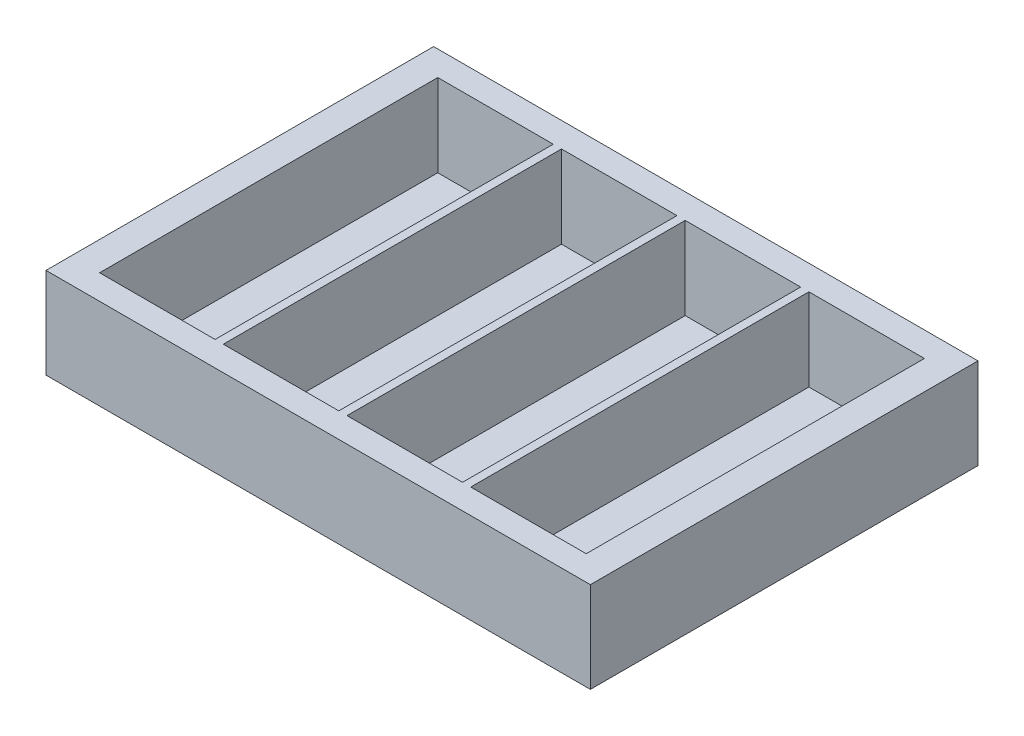
ISO-10303-21;
HEADER;
FILE_DESCRIPTION(('STEP AP214'),'2;1');
FILE_NAME('part.step','',(''),(''),'','','');
FILE_SCHEMA(('AUTOMOTIVE_DESIGN { 1 0 10303 214 1 1 1 1 }'));
ENDSEC;
DATA;
#1=APPLICATION_CONTEXT('core data for automotive mechanical design processes');
#2=APPLICATION_PROTOCOL_DEFINITION('international standard','automotive_design',2000,#1);
#3=PRODUCT_CONTEXT('',#1,'mechanical');
#4=PRODUCT('Part','Part','',(#3));
#5=PRODUCT_RELATED_PRODUCT_CATEGORY('part','',(#4));
#6=PRODUCT_DEFINITION_FORMATION('','',#4);
#7=PRODUCT_DEFINITION_CONTEXT('part definition',#1,'design');
#8=PRODUCT_DEFINITION('design','',#6,#7);
#9=PRODUCT_DEFINITION_SHAPE('','',#8);
#10=(LENGTH_UNIT() NAMED_UNIT(*) SI_UNIT(.MILLI.,.METRE.));
#11=(NAMED_UNIT(*) PLANE_ANGLE_UNIT() SI_UNIT($,.RADIAN.));
#12=(NAMED_UNIT(*) SI_UNIT($,.STERADIAN.) SOLID_ANGLE_UNIT());
#13=UNCERTAINTY_MEASURE_WITH_UNIT(LENGTH_MEASURE(1.E-05),#10,'distance_accuracy_value','');
#14=(GEOMETRIC_REPRESENTATION_CONTEXT(3) GLOBAL_UNCERTAINTY_ASSIGNED_CONTEXT((#13)) GLOBAL_UNIT_ASSIGNED_CONTEXT((#10,
#11,#12)) REPRESENTATION_CONTEXT('',''));
#15=CARTESIAN_POINT('',(0.,0.,0.));
#16=DIRECTION('',(0.,0.,1.));
#17=DIRECTION('',(1.,0.,0.));
#18=AXIS2_PLACEMENT_3D('',#15,#16,#17);
#19=CARTESIAN_POINT('',(-29.5,10.,-20.5));
#20=DIRECTION('',(0.,0.,1.));
#21=DIRECTION('',(1.,0.,0.));
#22=AXIS2_PLACEMENT_3D('',#19,#20,#21);
#23=PLANE('',#22);
#24=DIRECTION('',(-1.,0.,0.));
#25=VECTOR('',#24,1.);
#26=CARTESIAN_POINT('',(-29.5,10.,-20.5));
#27=LINE('',#26,#25);
#28=CARTESIAN_POINT('',(29.5,10.,-20.5));
#29=VERTEX_POINT('',#28);
#30=CARTESIAN_POINT('',(15.5,10.,-20.5));
#31=VERTEX_POINT('',#30);
#32=EDGE_CURVE('E188',#29,#31,#27,.T.);
#33=ORIENTED_EDGE('',*,*,#32,.T.);
#34=DIRECTION('',(0.,1.,0.));
#35=VECTOR('',#34,1.);
#36=CARTESIAN_POINT('',(15.5,0.,-20.5));
#37=LINE('',#36,#35);
#38=CARTESIAN_POINT('',(15.5,0.,-20.5));
#39=VERTEX_POINT('',#38);
#40=EDGE_CURVE('E63',#39,#31,#37,.T.);
#41=ORIENTED_EDGE('',*,*,#40,.F.);
#42=DIRECTION('',(-1.,0.,0.));
#43=VECTOR('',#42,1.);
#44=CARTESIAN_POINT('',(-29.5,0.,-20.5));
#45=LINE('',#44,#43);
#46=CARTESIAN_POINT('',(29.5,0.,-20.5));
#47=VERTEX_POINT('',#46);
#48=EDGE_CURVE('E281',#47,#39,#45,.T.);
#49=ORIENTED_EDGE('',*,*,#48,.F.);
#50=DIRECTION('',(0.,-1.,0.));
#51=VECTOR('',#50,1.);
#52=CARTESIAN_POINT('',(29.5,10.,-20.5));
#53=LINE('',#52,#51);
#54=EDGE_CURVE('E297',#29,#47,#53,.T.);
#55=ORIENTED_EDGE('',*,*,#54,.F.);
#56=EDGE_LOOP('',(#33,#41,#49,#55));
#57=FACE_BOUND('',#56,.T.);
#58=ADVANCED_FACE('F40',(#57),#23,.T.);
#59=CARTESIAN_POINT('',(-29.5,10.,20.5));
#60=DIRECTION('',(0.,0.,-1.));
#61=DIRECTION('',(-1.,0.,0.));
#62=AXIS2_PLACEMENT_3D('',#59,#60,#61);
#63=PLANE('',#62);
#64=DIRECTION('',(1.,0.,0.));
#65=VECTOR('',#64,1.);
#66=CARTESIAN_POINT('',(-29.5,0.,20.5));
#67=LINE('',#66,#65);
#68=CARTESIAN_POINT('',(15.5,0.,20.5));
#69=VERTEX_POINT('',#68);
#70=CARTESIAN_POINT('',(29.5,0.,20.5));
#71=VERTEX_POINT('',#70);
#72=EDGE_CURVE('E286',#69,#71,#67,.T.);
#73=ORIENTED_EDGE('',*,*,#72,.F.);
#74=DIRECTION('',(0.,1.,0.));
#75=VECTOR('',#74,1.);
#76=CARTESIAN_POINT('',(15.5,0.,20.5));
#77=LINE('',#76,#75);
#78=CARTESIAN_POINT('',(15.5,10.,20.5));
#79=VERTEX_POINT('',#78);
#80=EDGE_CURVE('E208',#69,#79,#77,.T.);
#81=ORIENTED_EDGE('',*,*,#80,.T.);
#82=DIRECTION('',(1.,0.,0.));
#83=VECTOR('',#82,1.);
#84=CARTESIAN_POINT('',(-29.5,10.,20.5));
#85=LINE('',#84,#83);
#86=CARTESIAN_POINT('',(29.5,10.,20.5));
#87=VERTEX_POINT('',#86);
#88=EDGE_CURVE('E272',#79,#87,#85,.T.);
#89=ORIENTED_EDGE('',*,*,#88,.T.);
#90=DIRECTION('',(0.,-1.,0.));
#91=VECTOR('',#90,1.);
#92=CARTESIAN_POINT('',(29.5,10.,20.5));
#93=LINE('',#92,#91);
#94=EDGE_CURVE('E276',#87,#71,#93,.T.);
#95=ORIENTED_EDGE('',*,*,#94,.T.);
#96=EDGE_LOOP('',(#73,#81,#89,#95));
#97=FACE_BOUND('',#96,.T.);
#98=ADVANCED_FACE('F362',(#97),#63,.T.);
#99=CARTESIAN_POINT('',(0.,0.,0.));
#100=DIRECTION('',(0.,-1.,0.));
#101=DIRECTION('',(0.,0.,-1.));
#102=AXIS2_PLACEMENT_3D('',#99,#100,#101);
#103=PLANE('',#102);
#104=DIRECTION('',(0.,0.,1.));
#105=VECTOR('',#104,1.);
#106=CARTESIAN_POINT('',(15.5,0.,0.));
#107=LINE('',#106,#105);
#108=EDGE_CURVE('E200',#39,#69,#107,.T.);
#109=ORIENTED_EDGE('',*,*,#108,.T.);
#110=ORIENTED_EDGE('',*,*,#72,.T.);
#111=DIRECTION('',(0.,0.,-1.));
#112=VECTOR('',#111,1.);
#113=CARTESIAN_POINT('',(29.5,0.,-20.5));
#114=LINE('',#113,#112);
#115=EDGE_CURVE('E264',#71,#47,#114,.T.);
#116=ORIENTED_EDGE('',*,*,#115,.T.);
#117=ORIENTED_EDGE('',*,*,#48,.T.);
#118=EDGE_LOOP('',(#109,#110,#116,#117));
#119=FACE_BOUND('',#118,.T.);
#120=ADVANCED_FACE('F375',(#119),#103,.F.);
#121=DIRECTION('',(0.,1.,0.));
#122=VECTOR('',#121,1.);
#123=CARTESIAN_POINT('',(14.5,0.,-20.5));
#124=LINE('',#123,#122);
#125=CARTESIAN_POINT('',(14.5,0.,-20.5));
#126=VERTEX_POINT('',#125);
#127=CARTESIAN_POINT('',(14.5,10.,-20.5));
#128=VERTEX_POINT('',#127);
#129=EDGE_CURVE('E192',#126,#128,#124,.T.);
#130=ORIENTED_EDGE('',*,*,#129,.T.);
#131=CARTESIAN_POINT('',(0.499999999999994,10.,-20.5));
#132=VERTEX_POINT('',#131);
#133=EDGE_CURVE('E177',#128,#132,#27,.T.);
#134=ORIENTED_EDGE('',*,*,#133,.T.);
#135=DIRECTION('',(0.,1.,0.));
#136=VECTOR('',#135,1.);
#137=CARTESIAN_POINT('',(0.499999999999998,0.,-20.5));
#138=LINE('',#137,#136);
#139=CARTESIAN_POINT('',(0.499999999999994,0.,-20.5));
#140=VERTEX_POINT('',#139);
#141=EDGE_CURVE('E222',#140,#132,#138,.T.);
#142=ORIENTED_EDGE('',*,*,#141,.F.);
#143=EDGE_CURVE('E194',#126,#140,#45,.T.);
#144=ORIENTED_EDGE('',*,*,#143,.F.);
#145=EDGE_LOOP('',(#130,#134,#142,#144));
#146=FACE_BOUND('',#145,.T.);
#147=ADVANCED_FACE('F193',(#146),#23,.T.);
#148=DIRECTION('',(0.,1.,0.));
#149=VECTOR('',#148,1.);
#150=CARTESIAN_POINT('',(14.5,0.,20.5));
#151=LINE('',#150,#149);
#152=CARTESIAN_POINT('',(14.5,0.,20.5));
#153=VERTEX_POINT('',#152);
#154=CARTESIAN_POINT('',(14.5,10.,20.5));
#155=VERTEX_POINT('',#154);
#156=EDGE_CURVE('E196',#153,#155,#151,.T.);
#157=ORIENTED_EDGE('',*,*,#156,.F.);
#158=CARTESIAN_POINT('',(0.499999999999997,0.,20.5));
#159=VERTEX_POINT('',#158);
#160=EDGE_CURVE('E376',#159,#153,#67,.T.);
#161=ORIENTED_EDGE('',*,*,#160,.F.);
#162=DIRECTION('',(0.,1.,0.));
#163=VECTOR('',#162,1.);
#164=CARTESIAN_POINT('',(0.500000000000003,0.,20.5));
#165=LINE('',#164,#163);
#166=CARTESIAN_POINT('',(0.500000000000003,10.,20.5));
#167=VERTEX_POINT('',#166);
#168=EDGE_CURVE('E225',#159,#167,#165,.T.);
#169=ORIENTED_EDGE('',*,*,#168,.T.);
#170=EDGE_CURVE('E356',#167,#155,#85,.T.);
#171=ORIENTED_EDGE('',*,*,#170,.T.);
#172=EDGE_LOOP('',(#157,#161,#169,#171));
#173=FACE_BOUND('',#172,.T.);
#174=ADVANCED_FACE('F387',(#173),#63,.T.);
#175=ORIENTED_EDGE('',*,*,#160,.T.);
#176=DIRECTION('',(0.,0.,1.));
#177=VECTOR('',#176,1.);
#178=CARTESIAN_POINT('',(14.5,0.,0.));
#179=LINE('',#178,#177);
#180=EDGE_CURVE('E55',#126,#153,#179,.T.);
#181=ORIENTED_EDGE('',*,*,#180,.F.);
#182=ORIENTED_EDGE('',*,*,#143,.T.);
#183=DIRECTION('',(0.,0.,1.));
#184=VECTOR('',#183,1.);
#185=CARTESIAN_POINT('',(0.5,0.,0.));
#186=LINE('',#185,#184);
#187=EDGE_CURVE('E216',#140,#159,#186,.T.);
#188=ORIENTED_EDGE('',*,*,#187,.T.);
#189=EDGE_LOOP('',(#175,#181,#182,#188));
#190=FACE_BOUND('',#189,.T.);
#191=ADVANCED_FACE('F394',(#190),#103,.F.);
#192=DIRECTION('',(0.,1.,0.));
#193=VECTOR('',#192,1.);
#194=CARTESIAN_POINT('',(-0.500000000000002,0.,-20.5));
#195=LINE('',#194,#193);
#196=CARTESIAN_POINT('',(-0.500000000000007,0.,-20.5));
#197=VERTEX_POINT('',#196);
#198=CARTESIAN_POINT('',(-0.500000000000007,10.,-20.5));
#199=VERTEX_POINT('',#198);
#200=EDGE_CURVE('E218',#197,#199,#195,.T.);
#201=ORIENTED_EDGE('',*,*,#200,.T.);
#202=CARTESIAN_POINT('',(-14.5,10.,-20.5));
#203=VERTEX_POINT('',#202);
#204=EDGE_CURVE('E189',#199,#203,#27,.T.);
#205=ORIENTED_EDGE('',*,*,#204,.T.);
#206=DIRECTION('',(0.,1.,0.));
#207=VECTOR('',#206,1.);
#208=CARTESIAN_POINT('',(-14.5,0.,-20.5));
#209=LINE('',#208,#207);
#210=CARTESIAN_POINT('',(-14.5,0.,-20.5));
#211=VERTEX_POINT('',#210);
#212=EDGE_CURVE('E238',#211,#203,#209,.T.);
#213=ORIENTED_EDGE('',*,*,#212,.F.);
#214=EDGE_CURVE('E422',#197,#211,#45,.T.);
#215=ORIENTED_EDGE('',*,*,#214,.F.);
#216=EDGE_LOOP('',(#201,#205,#213,#215));
#217=FACE_BOUND('',#216,.T.);
#218=ADVANCED_FACE('F345',(#217),#23,.T.);
#219=DIRECTION('',(0.,1.,0.));
#220=VECTOR('',#219,1.);
#221=CARTESIAN_POINT('',(-0.5,0.,20.5));
#222=LINE('',#221,#220);
#223=CARTESIAN_POINT('',(-0.500000000000007,0.,20.5));
#224=VERTEX_POINT('',#223);
#225=CARTESIAN_POINT('',(-0.500000000000007,10.,20.5));
#226=VERTEX_POINT('',#225);
#227=EDGE_CURVE('E228',#224,#226,#222,.T.);
#228=ORIENTED_EDGE('',*,*,#227,.F.);
#229=CARTESIAN_POINT('',(-14.5,0.,20.5));
#230=VERTEX_POINT('',#229);
#231=EDGE_CURVE('E289',#230,#224,#67,.T.);
#232=ORIENTED_EDGE('',*,*,#231,.F.);
#233=DIRECTION('',(0.,1.,0.));
#234=VECTOR('',#233,1.);
#235=CARTESIAN_POINT('',(-14.5,0.,20.5));
#236=LINE('',#235,#234);
#237=CARTESIAN_POINT('',(-14.5,10.,20.5));
#238=VERTEX_POINT('',#237);
#239=EDGE_CURVE('E242',#230,#238,#236,.T.);
#240=ORIENTED_EDGE('',*,*,#239,.T.);
#241=EDGE_CURVE('E277',#238,#226,#85,.T.);
#242=ORIENTED_EDGE('',*,*,#241,.T.);
#243=EDGE_LOOP('',(#228,#232,#240,#242));
#244=FACE_BOUND('',#243,.T.);
#245=ADVANCED_FACE('F383',(#244),#63,.T.);
#246=ORIENTED_EDGE('',*,*,#231,.T.);
#247=DIRECTION('',(0.,0.,1.));
#248=VECTOR('',#247,1.);
#249=CARTESIAN_POINT('',(-0.5,0.,0.));
#250=LINE('',#249,#248);
#251=EDGE_CURVE('E213',#197,#224,#250,.T.);
#252=ORIENTED_EDGE('',*,*,#251,.F.);
#253=ORIENTED_EDGE('',*,*,#214,.T.);
#254=DIRECTION('',(0.,0.,1.));
#255=VECTOR('',#254,1.);
#256=CARTESIAN_POINT('',(-14.5,0.,0.));
#257=LINE('',#256,#255);
#258=EDGE_CURVE('E232',#211,#230,#257,.T.);
#259=ORIENTED_EDGE('',*,*,#258,.T.);
#260=EDGE_LOOP('',(#246,#252,#253,#259));
#261=FACE_BOUND('',#260,.T.);
#262=ADVANCED_FACE('F335',(#261),#103,.F.);
#263=CARTESIAN_POINT('',(0.,10.,0.));
#264=DIRECTION('',(0.,1.,0.));
#265=DIRECTION('',(0.,0.,1.));
#266=AXIS2_PLACEMENT_3D('',#263,#264,#265);
#267=PLANE('',#266);
#268=DIRECTION('',(0.,0.,1.));
#269=VECTOR('',#268,1.);
#270=CARTESIAN_POINT('',(14.5,10.,0.));
#271=LINE('',#270,#269);
#272=EDGE_CURVE('E182',#128,#155,#271,.T.);
#273=ORIENTED_EDGE('',*,*,#272,.T.);
#274=ORIENTED_EDGE('',*,*,#170,.F.);
#275=DIRECTION('',(0.,0.,1.));
#276=VECTOR('',#275,1.);
#277=CARTESIAN_POINT('',(0.5,10.,0.));
#278=LINE('',#277,#276);
#279=EDGE_CURVE('E184',#132,#167,#278,.T.);
#280=ORIENTED_EDGE('',*,*,#279,.F.);
#281=ORIENTED_EDGE('',*,*,#133,.F.);
#282=EDGE_LOOP('',(#273,#274,#280,#281));
#283=FACE_BOUND('',#282,.T.);
#284=ORIENTED_EDGE('',*,*,#88,.F.);
#285=DIRECTION('',(0.,0.,1.));
#286=VECTOR('',#285,1.);
#287=CARTESIAN_POINT('',(15.5,10.,0.));
#288=LINE('',#287,#286);
#289=EDGE_CURVE('E201',#31,#79,#288,.T.);
#290=ORIENTED_EDGE('',*,*,#289,.F.);
#291=ORIENTED_EDGE('',*,*,#32,.F.);
#292=DIRECTION('',(0.,0.,-1.));
#293=VECTOR('',#292,1.);
#294=CARTESIAN_POINT('',(29.5,10.,-20.5));
#295=LINE('',#294,#293);
#296=EDGE_CURVE('E265',#87,#29,#295,.T.);
#297=ORIENTED_EDGE('',*,*,#296,.F.);
#298=EDGE_LOOP('',(#284,#290,#291,#297));
#299=FACE_BOUND('',#298,.T.);
#300=DIRECTION('',(0.,0.,1.));
#301=VECTOR('',#300,1.);
#302=CARTESIAN_POINT('',(-14.5,10.,0.));
#303=LINE('',#302,#301);
#304=EDGE_CURVE('E224',#203,#238,#303,.T.);
#305=ORIENTED_EDGE('',*,*,#304,.F.);
#306=ORIENTED_EDGE('',*,*,#204,.F.);
#307=DIRECTION('',(0.,0.,1.));
#308=VECTOR('',#307,1.);
#309=CARTESIAN_POINT('',(-0.5,10.,0.));
#310=LINE('',#309,#308);
#311=EDGE_CURVE('E210',#199,#226,#310,.T.);
#312=ORIENTED_EDGE('',*,*,#311,.T.);
#313=ORIENTED_EDGE('',*,*,#241,.F.);
#314=EDGE_LOOP('',(#305,#306,#312,#313));
#315=FACE_BOUND('',#314,.T.);
#316=DIRECTION('',(0.,0.,-1.));
#317=VECTOR('',#316,1.);
#318=CARTESIAN_POINT('',(33.,10.,-23.5));
#319=LINE('',#318,#317);
#320=CARTESIAN_POINT('',(33.,10.,23.5));
#321=VERTEX_POINT('',#320);
#322=CARTESIAN_POINT('',(33.,10.,-23.5));
#323=VERTEX_POINT('',#322);
#324=EDGE_CURVE('E300',#321,#323,#319,.T.);
#325=ORIENTED_EDGE('',*,*,#324,.T.);
#326=DIRECTION('',(-1.,0.,0.));
#327=VECTOR('',#326,1.);
#328=CARTESIAN_POINT('',(-33.,10.,-23.5));
#329=LINE('',#328,#327);
#330=CARTESIAN_POINT('',(-33.,10.,-23.5));
#331=VERTEX_POINT('',#330);
#332=EDGE_CURVE('E303',#323,#331,#329,.T.);
#333=ORIENTED_EDGE('',*,*,#332,.T.);
#334=DIRECTION('',(0.,0.,1.));
#335=VECTOR('',#334,1.);
#336=CARTESIAN_POINT('',(-33.,10.,-23.5));
#337=LINE('',#336,#335);
#338=CARTESIAN_POINT('',(-33.,10.,23.5));
#339=VERTEX_POINT('',#338);
#340=EDGE_CURVE('E305',#331,#339,#337,.T.);
#341=ORIENTED_EDGE('',*,*,#340,.T.);
#342=DIRECTION('',(1.,0.,0.));
#343=VECTOR('',#342,1.);
#344=CARTESIAN_POINT('',(-33.,10.,23.5));
#345=LINE('',#344,#343);
#346=EDGE_CURVE('E307',#339,#321,#345,.T.);
#347=ORIENTED_EDGE('',*,*,#346,.T.);
#348=EDGE_LOOP('',(#325,#333,#341,#347));
#349=FACE_BOUND('',#348,.T.);
#350=CARTESIAN_POINT('',(-15.5,10.,-20.5));
#351=VERTEX_POINT('',#350);
#352=CARTESIAN_POINT('',(-29.5,10.,-20.5));
#353=VERTEX_POINT('',#352);
#354=EDGE_CURVE('E266',#351,#353,#27,.T.);
#355=ORIENTED_EDGE('',*,*,#354,.F.);
#356=DIRECTION('',(0.,0.,1.));
#357=VECTOR('',#356,1.);
#358=CARTESIAN_POINT('',(-15.5,10.,0.));
#359=LINE('',#358,#357);
#360=CARTESIAN_POINT('',(-15.5,10.,20.5));
#361=VERTEX_POINT('',#360);
#362=EDGE_CURVE('E236',#351,#361,#359,.T.);
#363=ORIENTED_EDGE('',*,*,#362,.T.);
#364=CARTESIAN_POINT('',(-29.5,10.,20.5));
#365=VERTEX_POINT('',#364);
#366=EDGE_CURVE('E273',#365,#361,#85,.T.);
#367=ORIENTED_EDGE('',*,*,#366,.F.);
#368=DIRECTION('',(0.,0.,1.));
#369=VECTOR('',#368,1.);
#370=CARTESIAN_POINT('',(-29.5,10.,-20.5));
#371=LINE('',#370,#369);
#372=EDGE_CURVE('E269',#353,#365,#371,.T.);
#373=ORIENTED_EDGE('',*,*,#372,.F.);
#374=EDGE_LOOP('',(#355,#363,#367,#373));
#375=FACE_BOUND('',#374,.T.);
#376=ADVANCED_FACE('F179',(#283,#299,#315,#349,#375),#267,.T.);
#377=CARTESIAN_POINT('',(33.,10.,-23.5));
#378=DIRECTION('',(-1.,0.,0.));
#379=DIRECTION('',(0.,0.,1.));
#380=AXIS2_PLACEMENT_3D('',#377,#378,#379);
#381=PLANE('',#380);
#382=DIRECTION('',(0.,-1.,0.));
#383=VECTOR('',#382,1.);
#384=CARTESIAN_POINT('',(33.,10.,23.5));
#385=LINE('',#384,#383);
#386=CARTESIAN_POINT('',(33.,-1.,23.5));
#387=VERTEX_POINT('',#386);
#388=EDGE_CURVE('E309',#321,#387,#385,.T.);
#389=ORIENTED_EDGE('',*,*,#388,.T.);
#390=DIRECTION('',(0.,0.,1.));
#391=VECTOR('',#390,1.);
#392=CARTESIAN_POINT('',(33.,-1.,23.5));
#393=LINE('',#392,#391);
#394=CARTESIAN_POINT('',(33.,-1.,-23.5));
#395=VERTEX_POINT('',#394);
#396=EDGE_CURVE('E245',#395,#387,#393,.T.);
#397=ORIENTED_EDGE('',*,*,#396,.F.);
#398=DIRECTION('',(0.,-1.,0.));
#399=VECTOR('',#398,1.);
#400=CARTESIAN_POINT('',(33.,10.,-23.5));
#401=LINE('',#400,#399);
#402=EDGE_CURVE('E11',#323,#395,#401,.T.);
#403=ORIENTED_EDGE('',*,*,#402,.F.);
#404=ORIENTED_EDGE('',*,*,#324,.F.);
#405=EDGE_LOOP('',(#389,#397,#403,#404));
#406=FACE_BOUND('',#405,.T.);
#407=ADVANCED_FACE('F42',(#406),#381,.F.);
#408=CARTESIAN_POINT('',(-33.,10.,-23.5));
#409=DIRECTION('',(0.,0.,1.));
#410=DIRECTION('',(1.,0.,0.));
#411=AXIS2_PLACEMENT_3D('',#408,#409,#410);
#412=PLANE('',#411);
#413=ORIENTED_EDGE('',*,*,#402,.T.);
#414=DIRECTION('',(1.,0.,0.));
#415=VECTOR('',#414,1.);
#416=CARTESIAN_POINT('',(-33.,-1.,-23.5));
#417=LINE('',#416,#415);
#418=CARTESIAN_POINT('',(-33.,-1.,-23.5));
#419=VERTEX_POINT('',#418);
#420=EDGE_CURVE('E261',#419,#395,#417,.T.);
#421=ORIENTED_EDGE('',*,*,#420,.F.);
#422=DIRECTION('',(0.,-1.,0.));
#423=VECTOR('',#422,1.);
#424=CARTESIAN_POINT('',(-33.,10.,-23.5));
#425=LINE('',#424,#423);
#426=EDGE_CURVE('E48',#331,#419,#425,.T.);
#427=ORIENTED_EDGE('',*,*,#426,.F.);
#428=ORIENTED_EDGE('',*,*,#332,.F.);
#429=EDGE_LOOP('',(#413,#421,#427,#428));
#430=FACE_BOUND('',#429,.T.);
#431=ADVANCED_FACE('F324',(#430),#412,.F.);
#432=CARTESIAN_POINT('',(-33.,10.,-23.5));
#433=DIRECTION('',(1.,0.,0.));
#434=DIRECTION('',(0.,0.,-1.));
#435=AXIS2_PLACEMENT_3D('',#432,#433,#434);
#436=PLANE('',#435);
#437=ORIENTED_EDGE('',*,*,#426,.T.);
#438=DIRECTION('',(0.,0.,-1.));
#439=VECTOR('',#438,1.);
#440=CARTESIAN_POINT('',(-33.,-1.,23.5));
#441=LINE('',#440,#439);
#442=CARTESIAN_POINT('',(-33.,-1.,23.5));
#443=VERTEX_POINT('',#442);
#444=EDGE_CURVE('E258',#443,#419,#441,.T.);
#445=ORIENTED_EDGE('',*,*,#444,.F.);
#446=DIRECTION('',(0.,-1.,0.));
#447=VECTOR('',#446,1.);
#448=CARTESIAN_POINT('',(-33.,10.,23.5));
#449=LINE('',#448,#447);
#450=EDGE_CURVE('E311',#339,#443,#449,.T.);
#451=ORIENTED_EDGE('',*,*,#450,.F.);
#452=ORIENTED_EDGE('',*,*,#340,.F.);
#453=EDGE_LOOP('',(#437,#445,#451,#452));
#454=FACE_BOUND('',#453,.T.);
#455=ADVANCED_FACE('F316',(#454),#436,.F.);
#456=CARTESIAN_POINT('',(-33.,10.,23.5));
#457=DIRECTION('',(0.,0.,-1.));
#458=DIRECTION('',(-1.,0.,0.));
#459=AXIS2_PLACEMENT_3D('',#456,#457,#458);
#460=PLANE('',#459);
#461=ORIENTED_EDGE('',*,*,#450,.T.);
#462=DIRECTION('',(-1.,0.,0.));
#463=VECTOR('',#462,1.);
#464=CARTESIAN_POINT('',(-33.,-1.,23.5));
#465=LINE('',#464,#463);
#466=EDGE_CURVE('E255',#387,#443,#465,.T.);
#467=ORIENTED_EDGE('',*,*,#466,.F.);
#468=ORIENTED_EDGE('',*,*,#388,.F.);
#469=ORIENTED_EDGE('',*,*,#346,.F.);
#470=EDGE_LOOP('',(#461,#467,#468,#469));
#471=FACE_BOUND('',#470,.T.);
#472=ADVANCED_FACE('F331',(#471),#460,.F.);
#473=CARTESIAN_POINT('',(29.5,10.,-20.5));
#474=DIRECTION('',(-1.,0.,0.));
#475=DIRECTION('',(0.,0.,1.));
#476=AXIS2_PLACEMENT_3D('',#473,#474,#475);
#477=PLANE('',#476);
#478=ORIENTED_EDGE('',*,*,#115,.F.);
#479=ORIENTED_EDGE('',*,*,#94,.F.);
#480=ORIENTED_EDGE('',*,*,#296,.T.);
#481=ORIENTED_EDGE('',*,*,#54,.T.);
#482=EDGE_LOOP('',(#478,#479,#480,#481));
#483=FACE_BOUND('',#482,.T.);
#484=ADVANCED_FACE('F368',(#483),#477,.T.);
#485=DIRECTION('',(0.,1.,0.));
#486=VECTOR('',#485,1.);
#487=CARTESIAN_POINT('',(-15.5,0.,-20.5));
#488=LINE('',#487,#486);
#489=CARTESIAN_POINT('',(-15.5,0.,-20.5));
#490=VERTEX_POINT('',#489);
#491=EDGE_CURVE('E248',#490,#351,#488,.T.);
#492=ORIENTED_EDGE('',*,*,#491,.T.);
#493=ORIENTED_EDGE('',*,*,#354,.T.);
#494=DIRECTION('',(0.,-1.,0.));
#495=VECTOR('',#494,1.);
#496=CARTESIAN_POINT('',(-29.5,10.,-20.5));
#497=LINE('',#496,#495);
#498=CARTESIAN_POINT('',(-29.5,0.,-20.5));
#499=VERTEX_POINT('',#498);
#500=EDGE_CURVE('E294',#353,#499,#497,.T.);
#501=ORIENTED_EDGE('',*,*,#500,.T.);
#502=EDGE_CURVE('E280',#490,#499,#45,.T.);
#503=ORIENTED_EDGE('',*,*,#502,.F.);
#504=EDGE_LOOP('',(#492,#493,#501,#503));
#505=FACE_BOUND('',#504,.T.);
#506=ADVANCED_FACE('F396',(#505),#23,.T.);
#507=CARTESIAN_POINT('',(-29.5,10.,-20.5));
#508=DIRECTION('',(1.,0.,0.));
#509=DIRECTION('',(0.,0.,-1.));
#510=AXIS2_PLACEMENT_3D('',#507,#508,#509);
#511=PLANE('',#510);
#512=DIRECTION('',(0.,0.,1.));
#513=VECTOR('',#512,1.);
#514=CARTESIAN_POINT('',(-29.5,0.,-20.5));
#515=LINE('',#514,#513);
#516=CARTESIAN_POINT('',(-29.5,0.,20.5));
#517=VERTEX_POINT('',#516);
#518=EDGE_CURVE('E283',#499,#517,#515,.T.);
#519=ORIENTED_EDGE('',*,*,#518,.F.);
#520=ORIENTED_EDGE('',*,*,#500,.F.);
#521=ORIENTED_EDGE('',*,*,#372,.T.);
#522=DIRECTION('',(0.,-1.,0.));
#523=VECTOR('',#522,1.);
#524=CARTESIAN_POINT('',(-29.5,10.,20.5));
#525=LINE('',#524,#523);
#526=EDGE_CURVE('E292',#365,#517,#525,.T.);
#527=ORIENTED_EDGE('',*,*,#526,.T.);
#528=EDGE_LOOP('',(#519,#520,#521,#527));
#529=FACE_BOUND('',#528,.T.);
#530=ADVANCED_FACE('F399',(#529),#511,.T.);
#531=DIRECTION('',(0.,1.,0.));
#532=VECTOR('',#531,1.);
#533=CARTESIAN_POINT('',(-15.5,0.,20.5));
#534=LINE('',#533,#532);
#535=CARTESIAN_POINT('',(-15.5,0.,20.5));
#536=VERTEX_POINT('',#535);
#537=EDGE_CURVE('E246',#536,#361,#534,.T.);
#538=ORIENTED_EDGE('',*,*,#537,.F.);
#539=EDGE_CURVE('E267',#517,#536,#67,.T.);
#540=ORIENTED_EDGE('',*,*,#539,.F.);
#541=ORIENTED_EDGE('',*,*,#526,.F.);
#542=ORIENTED_EDGE('',*,*,#366,.T.);
#543=EDGE_LOOP('',(#538,#540,#541,#542));
#544=FACE_BOUND('',#543,.T.);
#545=ADVANCED_FACE('F386',(#544),#63,.T.);
#546=ORIENTED_EDGE('',*,*,#539,.T.);
#547=DIRECTION('',(0.,0.,1.));
#548=VECTOR('',#547,1.);
#549=CARTESIAN_POINT('',(-15.5,0.,0.));
#550=LINE('',#549,#548);
#551=EDGE_CURVE('E235',#490,#536,#550,.T.);
#552=ORIENTED_EDGE('',*,*,#551,.F.);
#553=ORIENTED_EDGE('',*,*,#502,.T.);
#554=ORIENTED_EDGE('',*,*,#518,.T.);
#555=EDGE_LOOP('',(#546,#552,#553,#554));
#556=FACE_BOUND('',#555,.T.);
#557=ADVANCED_FACE('F393',(#556),#103,.F.);
#558=CARTESIAN_POINT('',(0.,-1.,0.));
#559=DIRECTION('',(0.,-1.,0.));
#560=DIRECTION('',(0.,0.,-1.));
#561=AXIS2_PLACEMENT_3D('',#558,#559,#560);
#562=PLANE('',#561);
#563=ORIENTED_EDGE('',*,*,#396,.T.);
#564=ORIENTED_EDGE('',*,*,#466,.T.);
#565=ORIENTED_EDGE('',*,*,#444,.T.);
#566=ORIENTED_EDGE('',*,*,#420,.T.);
#567=EDGE_LOOP('',(#563,#564,#565,#566));
#568=FACE_BOUND('',#567,.T.);
#569=ADVANCED_FACE('F321',(#568),#562,.T.);
#570=CARTESIAN_POINT('',(-14.5,0.,0.));
#571=DIRECTION('',(-1.,0.,0.));
#572=DIRECTION('',(0.,0.,1.));
#573=AXIS2_PLACEMENT_3D('',#570,#571,#572);
#574=PLANE('',#573);
#575=ORIENTED_EDGE('',*,*,#304,.T.);
#576=ORIENTED_EDGE('',*,*,#239,.F.);
#577=ORIENTED_EDGE('',*,*,#258,.F.);
#578=ORIENTED_EDGE('',*,*,#212,.T.);
#579=EDGE_LOOP('',(#575,#576,#577,#578));
#580=FACE_BOUND('',#579,.T.);
#581=ADVANCED_FACE('F353',(#580),#574,.F.);
#582=CARTESIAN_POINT('',(-15.5,0.,0.));
#583=DIRECTION('',(-1.,0.,0.));
#584=DIRECTION('',(0.,0.,1.));
#585=AXIS2_PLACEMENT_3D('',#582,#583,#584);
#586=PLANE('',#585);
#587=ORIENTED_EDGE('',*,*,#362,.F.);
#588=ORIENTED_EDGE('',*,*,#491,.F.);
#589=ORIENTED_EDGE('',*,*,#551,.T.);
#590=ORIENTED_EDGE('',*,*,#537,.T.);
#591=EDGE_LOOP('',(#587,#588,#589,#590));
#592=FACE_BOUND('',#591,.T.);
#593=ADVANCED_FACE('F417',(#592),#586,.T.);
#594=CARTESIAN_POINT('',(0.5,0.,0.));
#595=DIRECTION('',(-1.,0.,0.));
#596=DIRECTION('',(0.,0.,1.));
#597=AXIS2_PLACEMENT_3D('',#594,#595,#596);
#598=PLANE('',#597);
#599=ORIENTED_EDGE('',*,*,#279,.T.);
#600=ORIENTED_EDGE('',*,*,#168,.F.);
#601=ORIENTED_EDGE('',*,*,#187,.F.);
#602=ORIENTED_EDGE('',*,*,#141,.T.);
#603=EDGE_LOOP('',(#599,#600,#601,#602));
#604=FACE_BOUND('',#603,.T.);
#605=ADVANCED_FACE('F426',(#604),#598,.F.);
#606=CARTESIAN_POINT('',(-0.5,0.,0.));
#607=DIRECTION('',(-1.,0.,0.));
#608=DIRECTION('',(0.,0.,1.));
#609=AXIS2_PLACEMENT_3D('',#606,#607,#608);
#610=PLANE('',#609);
#611=ORIENTED_EDGE('',*,*,#311,.F.);
#612=ORIENTED_EDGE('',*,*,#200,.F.);
#613=ORIENTED_EDGE('',*,*,#251,.T.);
#614=ORIENTED_EDGE('',*,*,#227,.T.);
#615=EDGE_LOOP('',(#611,#612,#613,#614));
#616=FACE_BOUND('',#615,.T.);
#617=ADVANCED_FACE('F382',(#616),#610,.T.);
#618=CARTESIAN_POINT('',(15.5,0.,0.));
#619=DIRECTION('',(-1.,0.,0.));
#620=DIRECTION('',(0.,0.,1.));
#621=AXIS2_PLACEMENT_3D('',#618,#619,#620);
#622=PLANE('',#621);
#623=ORIENTED_EDGE('',*,*,#289,.T.);
#624=ORIENTED_EDGE('',*,*,#80,.F.);
#625=ORIENTED_EDGE('',*,*,#108,.F.);
#626=ORIENTED_EDGE('',*,*,#40,.T.);
#627=EDGE_LOOP('',(#623,#624,#625,#626));
#628=FACE_BOUND('',#627,.T.);
#629=ADVANCED_FACE('F373',(#628),#622,.F.);
#630=CARTESIAN_POINT('',(14.5,0.,0.));
#631=DIRECTION('',(-1.,0.,0.));
#632=DIRECTION('',(0.,0.,1.));
#633=AXIS2_PLACEMENT_3D('',#630,#631,#632);
#634=PLANE('',#633);
#635=ORIENTED_EDGE('',*,*,#272,.F.);
#636=ORIENTED_EDGE('',*,*,#129,.F.);
#637=ORIENTED_EDGE('',*,*,#180,.T.);
#638=ORIENTED_EDGE('',*,*,#156,.T.);
#639=EDGE_LOOP('',(#635,#636,#637,#638));
#640=FACE_BOUND('',#639,.T.);
#641=ADVANCED_FACE('F199',(#640),#634,.T.);
#642=CLOSED_SHELL('',(#58,#98,#120,#147,#174,#191,#218,#245,#262,#376,#407,#431,#455,#472,#484,
#506,#530,#545,#557,#569,#581,#593,#605,#617,#629,#641));
#643=MANIFOLD_SOLID_BREP('B2',#642);
#644=ADVANCED_BREP_SHAPE_REPRESENTATION('',(#18,#643),#14);
#645=SHAPE_DEFINITION_REPRESENTATION(#9,#644);
ENDSEC;
END-ISO-10303-21;
